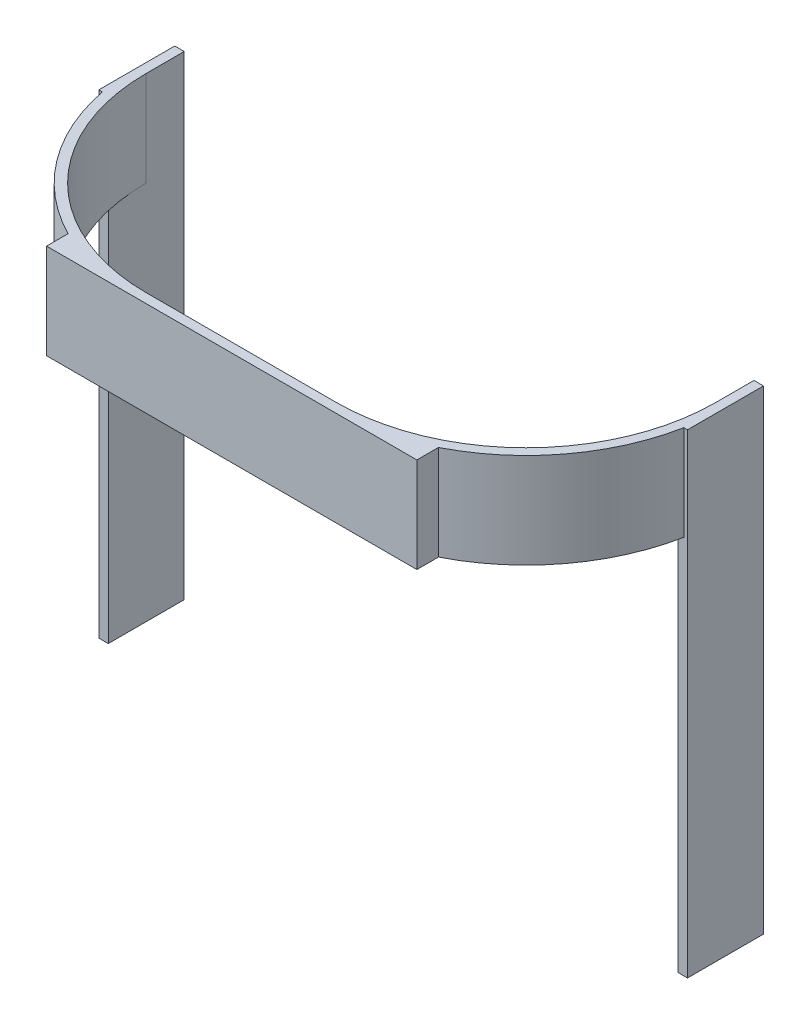
ISO-10303-21;
HEADER;
FILE_DESCRIPTION(('STEP AP214'),'2;1');
FILE_NAME('part.step','',(''),(''),'','','');
FILE_SCHEMA(('AUTOMOTIVE_DESIGN { 1 0 10303 214 1 1 1 1 }'));
ENDSEC;
DATA;
#1=APPLICATION_CONTEXT('core data for automotive mechanical design processes');
#2=APPLICATION_PROTOCOL_DEFINITION('international standard','automotive_design',2000,#1);
#3=PRODUCT_CONTEXT('',#1,'mechanical');
#4=PRODUCT('Part','Part','',(#3));
#5=PRODUCT_RELATED_PRODUCT_CATEGORY('part','',(#4));
#6=PRODUCT_DEFINITION_FORMATION('','',#4);
#7=PRODUCT_DEFINITION_CONTEXT('part definition',#1,'design');
#8=PRODUCT_DEFINITION('design','',#6,#7);
#9=PRODUCT_DEFINITION_SHAPE('','',#8);
#10=(LENGTH_UNIT() NAMED_UNIT(*) SI_UNIT(.MILLI.,.METRE.));
#11=(NAMED_UNIT(*) PLANE_ANGLE_UNIT() SI_UNIT($,.RADIAN.));
#12=(NAMED_UNIT(*) SI_UNIT($,.STERADIAN.) SOLID_ANGLE_UNIT());
#13=UNCERTAINTY_MEASURE_WITH_UNIT(LENGTH_MEASURE(1.E-05),#10,'distance_accuracy_value','');
#14=(GEOMETRIC_REPRESENTATION_CONTEXT(3) GLOBAL_UNCERTAINTY_ASSIGNED_CONTEXT((#13)) GLOBAL_UNIT_ASSIGNED_CONTEXT((#10,
#11,#12)) REPRESENTATION_CONTEXT('',''));
#15=CARTESIAN_POINT('',(0.,0.,0.));
#16=DIRECTION('',(0.,0.,1.));
#17=DIRECTION('',(1.,0.,0.));
#18=AXIS2_PLACEMENT_3D('',#15,#16,#17);
#19=CARTESIAN_POINT('',(40.,0.,0.));
#20=DIRECTION('',(0.,1.,0.));
#21=DIRECTION('',(0.,0.,1.));
#22=AXIS2_PLACEMENT_3D('',#19,#20,#21);
#23=PLANE('',#22);
#24=DIRECTION('',(0.,0.,1.));
#25=VECTOR('',#24,1.);
#26=CARTESIAN_POINT('',(-78.,0.,84.));
#27=LINE('',#26,#25);
#28=CARTESIAN_POINT('',(-78.,0.,74.9132832013121));
#29=VERTEX_POINT('',#28);
#30=CARTESIAN_POINT('',(-78.,0.,84.));
#31=VERTEX_POINT('',#30);
#32=EDGE_CURVE('E333',#29,#31,#27,.T.);
#33=ORIENTED_EDGE('',*,*,#32,.F.);
#34=CARTESIAN_POINT('',(-40.,0.,0.));
#35=DIRECTION('',(0.,1.,0.));
#36=DIRECTION('',(0.,0.,1.));
#37=AXIS2_PLACEMENT_3D('',#34,#35,#36);
#38=CIRCLE('',#37,84.);
#39=CARTESIAN_POINT('',(-122.462112512353,0.,16.));
#40=VERTEX_POINT('',#39);
#41=EDGE_CURVE('E163',#40,#29,#38,.T.);
#42=ORIENTED_EDGE('',*,*,#41,.F.);
#43=DIRECTION('',(-1.,0.,0.));
#44=VECTOR('',#43,1.);
#45=CARTESIAN_POINT('',(-124.,0.,16.));
#46=LINE('',#45,#44);
#47=CARTESIAN_POINT('',(-120.,0.,16.));
#48=VERTEX_POINT('',#47);
#49=EDGE_CURVE('E267',#48,#40,#46,.T.);
#50=ORIENTED_EDGE('',*,*,#49,.F.);
#51=DIRECTION('',(0.,0.,1.));
#52=VECTOR('',#51,1.);
#53=CARTESIAN_POINT('',(-120.,0.,-16.));
#54=LINE('',#53,#52);
#55=CARTESIAN_POINT('',(-120.,0.,0.));
#56=VERTEX_POINT('',#55);
#57=EDGE_CURVE('E11',#56,#48,#54,.T.);
#58=ORIENTED_EDGE('',*,*,#57,.F.);
#59=CARTESIAN_POINT('',(-40.,0.,0.));
#60=DIRECTION('',(0.,-1.,0.));
#61=DIRECTION('',(0.,0.,1.));
#62=AXIS2_PLACEMENT_3D('',#59,#60,#61);
#63=CIRCLE('',#62,80.);
#64=CARTESIAN_POINT('',(-40.,0.,80.));
#65=VERTEX_POINT('',#64);
#66=EDGE_CURVE('E160',#65,#56,#63,.T.);
#67=ORIENTED_EDGE('',*,*,#66,.F.);
#68=DIRECTION('',(-1.,0.,0.));
#69=VECTOR('',#68,1.);
#70=CARTESIAN_POINT('',(-40.,0.,80.));
#71=LINE('',#70,#69);
#72=CARTESIAN_POINT('',(40.,0.,80.));
#73=VERTEX_POINT('',#72);
#74=EDGE_CURVE('E157',#73,#65,#71,.T.);
#75=ORIENTED_EDGE('',*,*,#74,.F.);
#76=CARTESIAN_POINT('',(40.,0.,0.));
#77=DIRECTION('',(0.,-1.,0.));
#78=DIRECTION('',(0.,0.,1.));
#79=AXIS2_PLACEMENT_3D('',#76,#77,#78);
#80=CIRCLE('',#79,80.);
#81=CARTESIAN_POINT('',(120.,0.,0.));
#82=VERTEX_POINT('',#81);
#83=EDGE_CURVE('E154',#82,#73,#80,.T.);
#84=ORIENTED_EDGE('',*,*,#83,.F.);
#85=DIRECTION('',(0.,0.,-1.));
#86=VECTOR('',#85,1.);
#87=CARTESIAN_POINT('',(120.,0.,-16.));
#88=LINE('',#87,#86);
#89=CARTESIAN_POINT('',(120.,0.,16.));
#90=VERTEX_POINT('',#89);
#91=EDGE_CURVE('E85',#90,#82,#88,.T.);
#92=ORIENTED_EDGE('',*,*,#91,.F.);
#93=DIRECTION('',(-1.,0.,0.));
#94=VECTOR('',#93,1.);
#95=CARTESIAN_POINT('',(120.,0.,16.));
#96=LINE('',#95,#94);
#97=CARTESIAN_POINT('',(122.462112512353,0.,16.));
#98=VERTEX_POINT('',#97);
#99=EDGE_CURVE('E263',#98,#90,#96,.T.);
#100=ORIENTED_EDGE('',*,*,#99,.F.);
#101=CARTESIAN_POINT('',(40.,0.,0.));
#102=DIRECTION('',(0.,1.,0.));
#103=DIRECTION('',(0.,0.,1.));
#104=AXIS2_PLACEMENT_3D('',#101,#102,#103);
#105=CIRCLE('',#104,84.);
#106=CARTESIAN_POINT('',(78.,0.,74.9132832013121));
#107=VERTEX_POINT('',#106);
#108=EDGE_CURVE('E169',#107,#98,#105,.T.);
#109=ORIENTED_EDGE('',*,*,#108,.F.);
#110=DIRECTION('',(0.,0.,-1.));
#111=VECTOR('',#110,1.);
#112=CARTESIAN_POINT('',(78.,0.,84.));
#113=LINE('',#112,#111);
#114=CARTESIAN_POINT('',(78.,0.,84.));
#115=VERTEX_POINT('',#114);
#116=EDGE_CURVE('E331',#115,#107,#113,.T.);
#117=ORIENTED_EDGE('',*,*,#116,.F.);
#118=DIRECTION('',(1.,0.,0.));
#119=VECTOR('',#118,1.);
#120=CARTESIAN_POINT('',(-40.,0.,84.));
#121=LINE('',#120,#119);
#122=EDGE_CURVE('E166',#31,#115,#121,.T.);
#123=ORIENTED_EDGE('',*,*,#122,.F.);
#124=EDGE_LOOP('',(#33,#42,#50,#58,#67,#75,#84,#92,#100,#109,#117,#123));
#125=FACE_BOUND('',#124,.T.);
#126=ADVANCED_FACE('F37',(#125),#23,.F.);
#127=CARTESIAN_POINT('',(40.,40.,0.));
#128=DIRECTION('',(0.,-1.,0.));
#129=DIRECTION('',(0.,0.,-1.));
#130=AXIS2_PLACEMENT_3D('',#127,#128,#129);
#131=CYLINDRICAL_SURFACE('',#130,80.);
#132=ORIENTED_EDGE('',*,*,#83,.T.);
#133=DIRECTION('',(0.,-1.,0.));
#134=VECTOR('',#133,1.);
#135=CARTESIAN_POINT('',(40.,40.,80.));
#136=LINE('',#135,#134);
#137=CARTESIAN_POINT('',(40.,40.,80.));
#138=VERTEX_POINT('',#137);
#139=EDGE_CURVE('E41',#138,#73,#136,.T.);
#140=ORIENTED_EDGE('',*,*,#139,.F.);
#141=CARTESIAN_POINT('',(40.,40.,0.));
#142=DIRECTION('',(0.,-1.,0.));
#143=DIRECTION('',(0.,0.,1.));
#144=AXIS2_PLACEMENT_3D('',#141,#142,#143);
#145=CIRCLE('',#144,80.);
#146=CARTESIAN_POINT('',(120.,40.,0.));
#147=VERTEX_POINT('',#146);
#148=EDGE_CURVE('E172',#147,#138,#145,.T.);
#149=ORIENTED_EDGE('',*,*,#148,.F.);
#150=DIRECTION('',(0.,-1.,0.));
#151=VECTOR('',#150,1.);
#152=CARTESIAN_POINT('',(120.,40.,0.));
#153=LINE('',#152,#151);
#154=EDGE_CURVE('E150',#147,#82,#153,.T.);
#155=ORIENTED_EDGE('',*,*,#154,.T.);
#156=EDGE_LOOP('',(#132,#140,#149,#155));
#157=FACE_BOUND('',#156,.T.);
#158=ADVANCED_FACE('F39',(#157),#131,.F.);
#159=CARTESIAN_POINT('',(-40.,40.,80.));
#160=DIRECTION('',(0.,0.,1.));
#161=DIRECTION('',(1.,0.,0.));
#162=AXIS2_PLACEMENT_3D('',#159,#160,#161);
#163=PLANE('',#162);
#164=ORIENTED_EDGE('',*,*,#74,.T.);
#165=DIRECTION('',(0.,-1.,0.));
#166=VECTOR('',#165,1.);
#167=CARTESIAN_POINT('',(-40.,40.,80.));
#168=LINE('',#167,#166);
#169=CARTESIAN_POINT('',(-40.,40.,80.));
#170=VERTEX_POINT('',#169);
#171=EDGE_CURVE('E192',#170,#65,#168,.T.);
#172=ORIENTED_EDGE('',*,*,#171,.F.);
#173=DIRECTION('',(-1.,0.,0.));
#174=VECTOR('',#173,1.);
#175=CARTESIAN_POINT('',(-40.,40.,80.));
#176=LINE('',#175,#174);
#177=EDGE_CURVE('E94',#138,#170,#176,.T.);
#178=ORIENTED_EDGE('',*,*,#177,.F.);
#179=ORIENTED_EDGE('',*,*,#139,.T.);
#180=EDGE_LOOP('',(#164,#172,#178,#179));
#181=FACE_BOUND('',#180,.T.);
#182=ADVANCED_FACE('F198',(#181),#163,.F.);
#183=CARTESIAN_POINT('',(-40.,40.,0.));
#184=DIRECTION('',(0.,-1.,0.));
#185=DIRECTION('',(0.,0.,-1.));
#186=AXIS2_PLACEMENT_3D('',#183,#184,#185);
#187=CYLINDRICAL_SURFACE('',#186,80.);
#188=ORIENTED_EDGE('',*,*,#66,.T.);
#189=DIRECTION('',(0.,-1.,0.));
#190=VECTOR('',#189,1.);
#191=CARTESIAN_POINT('',(-120.,40.,0.));
#192=LINE('',#191,#190);
#193=CARTESIAN_POINT('',(-120.,40.,0.));
#194=VERTEX_POINT('',#193);
#195=EDGE_CURVE('E190',#194,#56,#192,.T.);
#196=ORIENTED_EDGE('',*,*,#195,.F.);
#197=CARTESIAN_POINT('',(-40.,40.,0.));
#198=DIRECTION('',(0.,-1.,0.));
#199=DIRECTION('',(0.,0.,1.));
#200=AXIS2_PLACEMENT_3D('',#197,#198,#199);
#201=CIRCLE('',#200,80.);
#202=EDGE_CURVE('E219',#170,#194,#201,.T.);
#203=ORIENTED_EDGE('',*,*,#202,.F.);
#204=ORIENTED_EDGE('',*,*,#171,.T.);
#205=EDGE_LOOP('',(#188,#196,#203,#204));
#206=FACE_BOUND('',#205,.T.);
#207=ADVANCED_FACE('F208',(#206),#187,.F.);
#208=CARTESIAN_POINT('',(-120.,40.,-16.));
#209=DIRECTION('',(-1.,0.,0.));
#210=DIRECTION('',(0.,0.,1.));
#211=AXIS2_PLACEMENT_3D('',#208,#209,#210);
#212=PLANE('',#211);
#213=ORIENTED_EDGE('',*,*,#195,.T.);
#214=ORIENTED_EDGE('',*,*,#57,.T.);
#215=DIRECTION('',(0.,1.,0.));
#216=VECTOR('',#215,1.);
#217=CARTESIAN_POINT('',(-120.,-160.,16.));
#218=LINE('',#217,#216);
#219=CARTESIAN_POINT('',(-120.,-160.,16.));
#220=VERTEX_POINT('',#219);
#221=EDGE_CURVE('E158',#220,#48,#218,.T.);
#222=ORIENTED_EDGE('',*,*,#221,.F.);
#223=DIRECTION('',(0.,0.,1.));
#224=VECTOR('',#223,1.);
#225=CARTESIAN_POINT('',(-120.,-160.,-16.));
#226=LINE('',#225,#224);
#227=CARTESIAN_POINT('',(-120.,-160.,-16.));
#228=VERTEX_POINT('',#227);
#229=EDGE_CURVE('E274',#228,#220,#226,.T.);
#230=ORIENTED_EDGE('',*,*,#229,.F.);
#231=DIRECTION('',(0.,-1.,0.));
#232=VECTOR('',#231,1.);
#233=CARTESIAN_POINT('',(-120.,40.,-16.));
#234=LINE('',#233,#232);
#235=CARTESIAN_POINT('',(-120.,40.,-16.));
#236=VERTEX_POINT('',#235);
#237=EDGE_CURVE('E187',#236,#228,#234,.T.);
#238=ORIENTED_EDGE('',*,*,#237,.F.);
#239=DIRECTION('',(0.,0.,-1.));
#240=VECTOR('',#239,1.);
#241=CARTESIAN_POINT('',(-120.,40.,-16.));
#242=LINE('',#241,#240);
#243=EDGE_CURVE('E215',#194,#236,#242,.T.);
#244=ORIENTED_EDGE('',*,*,#243,.F.);
#245=EDGE_LOOP('',(#213,#214,#222,#230,#238,#244));
#246=FACE_BOUND('',#245,.T.);
#247=ADVANCED_FACE('F211',(#246),#212,.F.);
#248=CARTESIAN_POINT('',(-124.,40.,-16.));
#249=DIRECTION('',(0.,0.,1.));
#250=DIRECTION('',(1.,0.,0.));
#251=AXIS2_PLACEMENT_3D('',#248,#249,#250);
#252=PLANE('',#251);
#253=ORIENTED_EDGE('',*,*,#237,.T.);
#254=DIRECTION('',(1.,0.,0.));
#255=VECTOR('',#254,1.);
#256=CARTESIAN_POINT('',(-124.,-160.,-16.));
#257=LINE('',#256,#255);
#258=CARTESIAN_POINT('',(-124.,-160.,-16.));
#259=VERTEX_POINT('',#258);
#260=EDGE_CURVE('E271',#259,#228,#257,.T.);
#261=ORIENTED_EDGE('',*,*,#260,.F.);
#262=DIRECTION('',(0.,-1.,0.));
#263=VECTOR('',#262,1.);
#264=CARTESIAN_POINT('',(-124.,40.,-16.));
#265=LINE('',#264,#263);
#266=CARTESIAN_POINT('',(-124.,40.,-16.));
#267=VERTEX_POINT('',#266);
#268=EDGE_CURVE('E184',#267,#259,#265,.T.);
#269=ORIENTED_EDGE('',*,*,#268,.F.);
#270=DIRECTION('',(-1.,0.,0.));
#271=VECTOR('',#270,1.);
#272=CARTESIAN_POINT('',(-124.,40.,-16.));
#273=LINE('',#272,#271);
#274=EDGE_CURVE('E218',#236,#267,#273,.T.);
#275=ORIENTED_EDGE('',*,*,#274,.F.);
#276=EDGE_LOOP('',(#253,#261,#269,#275));
#277=FACE_BOUND('',#276,.T.);
#278=ADVANCED_FACE('F386',(#277),#252,.F.);
#279=CARTESIAN_POINT('',(-124.,40.,-16.));
#280=DIRECTION('',(1.,0.,0.));
#281=DIRECTION('',(0.,0.,-1.));
#282=AXIS2_PLACEMENT_3D('',#279,#280,#281);
#283=PLANE('',#282);
#284=ORIENTED_EDGE('',*,*,#268,.T.);
#285=DIRECTION('',(0.,0.,-1.));
#286=VECTOR('',#285,1.);
#287=CARTESIAN_POINT('',(-124.,-160.,-16.));
#288=LINE('',#287,#286);
#289=CARTESIAN_POINT('',(-124.,-160.,16.));
#290=VERTEX_POINT('',#289);
#291=EDGE_CURVE('E268',#290,#259,#288,.T.);
#292=ORIENTED_EDGE('',*,*,#291,.F.);
#293=DIRECTION('',(0.,-1.,0.));
#294=VECTOR('',#293,1.);
#295=CARTESIAN_POINT('',(-124.,40.,16.));
#296=LINE('',#295,#294);
#297=CARTESIAN_POINT('',(-124.,40.,16.));
#298=VERTEX_POINT('',#297);
#299=EDGE_CURVE('E181',#298,#290,#296,.T.);
#300=ORIENTED_EDGE('',*,*,#299,.F.);
#301=DIRECTION('',(0.,0.,1.));
#302=VECTOR('',#301,1.);
#303=CARTESIAN_POINT('',(-124.,40.,-16.));
#304=LINE('',#303,#302);
#305=EDGE_CURVE('E221',#267,#298,#304,.T.);
#306=ORIENTED_EDGE('',*,*,#305,.F.);
#307=EDGE_LOOP('',(#284,#292,#300,#306));
#308=FACE_BOUND('',#307,.T.);
#309=ADVANCED_FACE('F382',(#308),#283,.F.);
#310=CARTESIAN_POINT('',(-124.,40.,16.));
#311=DIRECTION('',(0.,0.,-1.));
#312=DIRECTION('',(-1.,0.,0.));
#313=AXIS2_PLACEMENT_3D('',#310,#311,#312);
#314=PLANE('',#313);
#315=ORIENTED_EDGE('',*,*,#299,.T.);
#316=DIRECTION('',(-1.,0.,0.));
#317=VECTOR('',#316,1.);
#318=CARTESIAN_POINT('',(-124.,-160.,16.));
#319=LINE('',#318,#317);
#320=EDGE_CURVE('E277',#220,#290,#319,.T.);
#321=ORIENTED_EDGE('',*,*,#320,.F.);
#322=ORIENTED_EDGE('',*,*,#221,.T.);
#323=ORIENTED_EDGE('',*,*,#49,.T.);
#324=DIRECTION('',(0.,-1.,0.));
#325=VECTOR('',#324,1.);
#326=CARTESIAN_POINT('',(-122.462112512353,40.,16.));
#327=LINE('',#326,#325);
#328=CARTESIAN_POINT('',(-122.462112512353,40.,16.));
#329=VERTEX_POINT('',#328);
#330=EDGE_CURVE('E179',#329,#40,#327,.T.);
#331=ORIENTED_EDGE('',*,*,#330,.F.);
#332=DIRECTION('',(1.,0.,0.));
#333=VECTOR('',#332,1.);
#334=CARTESIAN_POINT('',(-124.,40.,16.));
#335=LINE('',#334,#333);
#336=EDGE_CURVE('E227',#298,#329,#335,.T.);
#337=ORIENTED_EDGE('',*,*,#336,.F.);
#338=EDGE_LOOP('',(#315,#321,#322,#323,#331,#337));
#339=FACE_BOUND('',#338,.T.);
#340=ADVANCED_FACE('F285',(#339),#314,.F.);
#341=CARTESIAN_POINT('',(-40.,40.,0.));
#342=DIRECTION('',(0.,-1.,0.));
#343=DIRECTION('',(0.,0.,-1.));
#344=AXIS2_PLACEMENT_3D('',#341,#342,#343);
#345=CYLINDRICAL_SURFACE('',#344,84.);
#346=ORIENTED_EDGE('',*,*,#41,.T.);
#347=DIRECTION('',(0.,1.,0.));
#348=VECTOR('',#347,1.);
#349=CARTESIAN_POINT('',(-78.,0.,74.9132832013121));
#350=LINE('',#349,#348);
#351=CARTESIAN_POINT('',(-78.,40.,74.9132832013121));
#352=VERTEX_POINT('',#351);
#353=EDGE_CURVE('E332',#29,#352,#350,.T.);
#354=ORIENTED_EDGE('',*,*,#353,.T.);
#355=CARTESIAN_POINT('',(-40.,40.,0.));
#356=DIRECTION('',(0.,1.,0.));
#357=DIRECTION('',(0.,0.,1.));
#358=AXIS2_PLACEMENT_3D('',#355,#356,#357);
#359=CIRCLE('',#358,84.);
#360=EDGE_CURVE('E229',#329,#352,#359,.T.);
#361=ORIENTED_EDGE('',*,*,#360,.F.);
#362=ORIENTED_EDGE('',*,*,#330,.T.);
#363=EDGE_LOOP('',(#346,#354,#361,#362));
#364=FACE_BOUND('',#363,.T.);
#365=ADVANCED_FACE('F375',(#364),#345,.T.);
#366=CARTESIAN_POINT('',(-40.,40.,84.));
#367=DIRECTION('',(0.,0.,-1.));
#368=DIRECTION('',(-1.,0.,0.));
#369=AXIS2_PLACEMENT_3D('',#366,#367,#368);
#370=PLANE('',#369);
#371=ORIENTED_EDGE('',*,*,#122,.T.);
#372=DIRECTION('',(0.,1.,0.));
#373=VECTOR('',#372,1.);
#374=CARTESIAN_POINT('',(78.,0.,84.));
#375=LINE('',#374,#373);
#376=CARTESIAN_POINT('',(78.,40.,84.));
#377=VERTEX_POINT('',#376);
#378=EDGE_CURVE('E324',#115,#377,#375,.T.);
#379=ORIENTED_EDGE('',*,*,#378,.T.);
#380=DIRECTION('',(1.,0.,0.));
#381=VECTOR('',#380,1.);
#382=CARTESIAN_POINT('',(-40.,40.,84.));
#383=LINE('',#382,#381);
#384=CARTESIAN_POINT('',(-78.,40.,84.));
#385=VERTEX_POINT('',#384);
#386=EDGE_CURVE('E231',#385,#377,#383,.T.);
#387=ORIENTED_EDGE('',*,*,#386,.F.);
#388=DIRECTION('',(0.,1.,0.));
#389=VECTOR('',#388,1.);
#390=CARTESIAN_POINT('',(-78.,0.,84.));
#391=LINE('',#390,#389);
#392=EDGE_CURVE('E326',#31,#385,#391,.T.);
#393=ORIENTED_EDGE('',*,*,#392,.F.);
#394=EDGE_LOOP('',(#371,#379,#387,#393));
#395=FACE_BOUND('',#394,.T.);
#396=ADVANCED_FACE('F323',(#395),#370,.F.);
#397=CARTESIAN_POINT('',(40.,40.,0.));
#398=DIRECTION('',(0.,-1.,0.));
#399=DIRECTION('',(0.,0.,-1.));
#400=AXIS2_PLACEMENT_3D('',#397,#398,#399);
#401=CYLINDRICAL_SURFACE('',#400,84.);
#402=CARTESIAN_POINT('',(40.,40.,0.));
#403=DIRECTION('',(0.,1.,0.));
#404=DIRECTION('',(0.,0.,1.));
#405=AXIS2_PLACEMENT_3D('',#402,#403,#404);
#406=CIRCLE('',#405,84.);
#407=CARTESIAN_POINT('',(78.,40.,74.9132832013121));
#408=VERTEX_POINT('',#407);
#409=CARTESIAN_POINT('',(122.462112512353,40.,16.));
#410=VERTEX_POINT('',#409);
#411=EDGE_CURVE('E233',#408,#410,#406,.T.);
#412=ORIENTED_EDGE('',*,*,#411,.F.);
#413=DIRECTION('',(0.,-1.,0.));
#414=VECTOR('',#413,1.);
#415=CARTESIAN_POINT('',(78.,40.,74.9132832013121));
#416=LINE('',#415,#414);
#417=EDGE_CURVE('E264',#408,#107,#416,.T.);
#418=ORIENTED_EDGE('',*,*,#417,.T.);
#419=ORIENTED_EDGE('',*,*,#108,.T.);
#420=DIRECTION('',(0.,-1.,0.));
#421=VECTOR('',#420,1.);
#422=CARTESIAN_POINT('',(122.462112512353,40.,16.));
#423=LINE('',#422,#421);
#424=EDGE_CURVE('E176',#410,#98,#423,.T.);
#425=ORIENTED_EDGE('',*,*,#424,.F.);
#426=EDGE_LOOP('',(#412,#418,#419,#425));
#427=FACE_BOUND('',#426,.T.);
#428=ADVANCED_FACE('F238',(#427),#401,.T.);
#429=CARTESIAN_POINT('',(122.462112512353,40.,16.));
#430=DIRECTION('',(0.,0.,-1.));
#431=DIRECTION('',(-1.,0.,0.));
#432=AXIS2_PLACEMENT_3D('',#429,#430,#431);
#433=PLANE('',#432);
#434=ORIENTED_EDGE('',*,*,#424,.T.);
#435=ORIENTED_EDGE('',*,*,#99,.T.);
#436=DIRECTION('',(0.,1.,0.));
#437=VECTOR('',#436,1.);
#438=CARTESIAN_POINT('',(120.,-160.,16.));
#439=LINE('',#438,#437);
#440=CARTESIAN_POINT('',(120.,-160.,16.));
#441=VERTEX_POINT('',#440);
#442=EDGE_CURVE('E256',#441,#90,#439,.T.);
#443=ORIENTED_EDGE('',*,*,#442,.F.);
#444=DIRECTION('',(-1.,0.,0.));
#445=VECTOR('',#444,1.);
#446=CARTESIAN_POINT('',(120.,-160.,16.));
#447=LINE('',#446,#445);
#448=CARTESIAN_POINT('',(124.,-160.,16.));
#449=VERTEX_POINT('',#448);
#450=EDGE_CURVE('E248',#449,#441,#447,.T.);
#451=ORIENTED_EDGE('',*,*,#450,.F.);
#452=DIRECTION('',(0.,-1.,0.));
#453=VECTOR('',#452,1.);
#454=CARTESIAN_POINT('',(124.,40.,16.));
#455=LINE('',#454,#453);
#456=CARTESIAN_POINT('',(124.,40.,16.));
#457=VERTEX_POINT('',#456);
#458=EDGE_CURVE('E144',#457,#449,#455,.T.);
#459=ORIENTED_EDGE('',*,*,#458,.F.);
#460=DIRECTION('',(1.,0.,0.));
#461=VECTOR('',#460,1.);
#462=CARTESIAN_POINT('',(122.462112512353,40.,16.));
#463=LINE('',#462,#461);
#464=EDGE_CURVE('E129',#410,#457,#463,.T.);
#465=ORIENTED_EDGE('',*,*,#464,.F.);
#466=EDGE_LOOP('',(#434,#435,#443,#451,#459,#465));
#467=FACE_BOUND('',#466,.T.);
#468=ADVANCED_FACE('F243',(#467),#433,.F.);
#469=CARTESIAN_POINT('',(124.,40.,-16.));
#470=DIRECTION('',(-1.,0.,0.));
#471=DIRECTION('',(0.,0.,1.));
#472=AXIS2_PLACEMENT_3D('',#469,#470,#471);
#473=PLANE('',#472);
#474=ORIENTED_EDGE('',*,*,#458,.T.);
#475=DIRECTION('',(0.,0.,1.));
#476=VECTOR('',#475,1.);
#477=CARTESIAN_POINT('',(124.,-160.,-16.));
#478=LINE('',#477,#476);
#479=CARTESIAN_POINT('',(124.,-160.,-16.));
#480=VERTEX_POINT('',#479);
#481=EDGE_CURVE('E140',#480,#449,#478,.T.);
#482=ORIENTED_EDGE('',*,*,#481,.F.);
#483=DIRECTION('',(0.,-1.,0.));
#484=VECTOR('',#483,1.);
#485=CARTESIAN_POINT('',(124.,40.,-16.));
#486=LINE('',#485,#484);
#487=CARTESIAN_POINT('',(124.,40.,-16.));
#488=VERTEX_POINT('',#487);
#489=EDGE_CURVE('E136',#488,#480,#486,.T.);
#490=ORIENTED_EDGE('',*,*,#489,.F.);
#491=DIRECTION('',(0.,0.,-1.));
#492=VECTOR('',#491,1.);
#493=CARTESIAN_POINT('',(124.,40.,-16.));
#494=LINE('',#493,#492);
#495=EDGE_CURVE('E121',#457,#488,#494,.T.);
#496=ORIENTED_EDGE('',*,*,#495,.F.);
#497=EDGE_LOOP('',(#474,#482,#490,#496));
#498=FACE_BOUND('',#497,.T.);
#499=ADVANCED_FACE('F137',(#498),#473,.F.);
#500=CARTESIAN_POINT('',(120.,40.,-16.));
#501=DIRECTION('',(0.,0.,1.));
#502=DIRECTION('',(1.,0.,0.));
#503=AXIS2_PLACEMENT_3D('',#500,#501,#502);
#504=PLANE('',#503);
#505=ORIENTED_EDGE('',*,*,#489,.T.);
#506=DIRECTION('',(1.,0.,0.));
#507=VECTOR('',#506,1.);
#508=CARTESIAN_POINT('',(120.,-160.,-16.));
#509=LINE('',#508,#507);
#510=CARTESIAN_POINT('',(120.,-160.,-16.));
#511=VERTEX_POINT('',#510);
#512=EDGE_CURVE('E254',#511,#480,#509,.T.);
#513=ORIENTED_EDGE('',*,*,#512,.F.);
#514=DIRECTION('',(0.,-1.,0.));
#515=VECTOR('',#514,1.);
#516=CARTESIAN_POINT('',(120.,40.,-16.));
#517=LINE('',#516,#515);
#518=CARTESIAN_POINT('',(120.,40.,-16.));
#519=VERTEX_POINT('',#518);
#520=EDGE_CURVE('E145',#519,#511,#517,.T.);
#521=ORIENTED_EDGE('',*,*,#520,.F.);
#522=DIRECTION('',(-1.,0.,0.));
#523=VECTOR('',#522,1.);
#524=CARTESIAN_POINT('',(120.,40.,-16.));
#525=LINE('',#524,#523);
#526=EDGE_CURVE('E126',#488,#519,#525,.T.);
#527=ORIENTED_EDGE('',*,*,#526,.F.);
#528=EDGE_LOOP('',(#505,#513,#521,#527));
#529=FACE_BOUND('',#528,.T.);
#530=ADVANCED_FACE('F147',(#529),#504,.F.);
#531=CARTESIAN_POINT('',(120.,40.,-16.));
#532=DIRECTION('',(1.,0.,0.));
#533=DIRECTION('',(0.,0.,-1.));
#534=AXIS2_PLACEMENT_3D('',#531,#532,#533);
#535=PLANE('',#534);
#536=ORIENTED_EDGE('',*,*,#520,.T.);
#537=DIRECTION('',(0.,0.,-1.));
#538=VECTOR('',#537,1.);
#539=CARTESIAN_POINT('',(120.,-160.,-16.));
#540=LINE('',#539,#538);
#541=EDGE_CURVE('E258',#441,#511,#540,.T.);
#542=ORIENTED_EDGE('',*,*,#541,.F.);
#543=ORIENTED_EDGE('',*,*,#442,.T.);
#544=ORIENTED_EDGE('',*,*,#91,.T.);
#545=ORIENTED_EDGE('',*,*,#154,.F.);
#546=DIRECTION('',(0.,0.,1.));
#547=VECTOR('',#546,1.);
#548=CARTESIAN_POINT('',(120.,40.,-16.));
#549=LINE('',#548,#547);
#550=EDGE_CURVE('E61',#519,#147,#549,.T.);
#551=ORIENTED_EDGE('',*,*,#550,.F.);
#552=EDGE_LOOP('',(#536,#542,#543,#544,#545,#551));
#553=FACE_BOUND('',#552,.T.);
#554=ADVANCED_FACE('F346',(#553),#535,.F.);
#555=CARTESIAN_POINT('',(40.,40.,0.));
#556=DIRECTION('',(0.,1.,0.));
#557=DIRECTION('',(0.,0.,1.));
#558=AXIS2_PLACEMENT_3D('',#555,#556,#557);
#559=PLANE('',#558);
#560=ORIENTED_EDGE('',*,*,#360,.T.);
#561=DIRECTION('',(0.,0.,1.));
#562=VECTOR('',#561,1.);
#563=CARTESIAN_POINT('',(-78.,40.,84.));
#564=LINE('',#563,#562);
#565=EDGE_CURVE('E335',#352,#385,#564,.T.);
#566=ORIENTED_EDGE('',*,*,#565,.T.);
#567=ORIENTED_EDGE('',*,*,#386,.T.);
#568=DIRECTION('',(0.,0.,-1.));
#569=VECTOR('',#568,1.);
#570=CARTESIAN_POINT('',(78.,40.,84.));
#571=LINE('',#570,#569);
#572=EDGE_CURVE('E53',#377,#408,#571,.T.);
#573=ORIENTED_EDGE('',*,*,#572,.T.);
#574=ORIENTED_EDGE('',*,*,#411,.T.);
#575=ORIENTED_EDGE('',*,*,#464,.T.);
#576=ORIENTED_EDGE('',*,*,#495,.T.);
#577=ORIENTED_EDGE('',*,*,#526,.T.);
#578=ORIENTED_EDGE('',*,*,#550,.T.);
#579=ORIENTED_EDGE('',*,*,#148,.T.);
#580=ORIENTED_EDGE('',*,*,#177,.T.);
#581=ORIENTED_EDGE('',*,*,#202,.T.);
#582=ORIENTED_EDGE('',*,*,#243,.T.);
#583=ORIENTED_EDGE('',*,*,#274,.T.);
#584=ORIENTED_EDGE('',*,*,#305,.T.);
#585=ORIENTED_EDGE('',*,*,#336,.T.);
#586=EDGE_LOOP('',(#560,#566,#567,#573,#574,#575,#576,#577,#578,#579,#580,#581,#582,#583,#584,#585));
#587=FACE_BOUND('',#586,.T.);
#588=ADVANCED_FACE('F124',(#587),#559,.T.);
#589=CARTESIAN_POINT('',(0.,-160.,0.));
#590=DIRECTION('',(0.,1.,0.));
#591=DIRECTION('',(0.,0.,1.));
#592=AXIS2_PLACEMENT_3D('',#589,#590,#591);
#593=PLANE('',#592);
#594=ORIENTED_EDGE('',*,*,#291,.T.);
#595=ORIENTED_EDGE('',*,*,#260,.T.);
#596=ORIENTED_EDGE('',*,*,#229,.T.);
#597=ORIENTED_EDGE('',*,*,#320,.T.);
#598=EDGE_LOOP('',(#594,#595,#596,#597));
#599=FACE_BOUND('',#598,.T.);
#600=ADVANCED_FACE('F353',(#599),#593,.F.);
#601=CARTESIAN_POINT('',(0.,-160.,0.));
#602=DIRECTION('',(0.,1.,0.));
#603=DIRECTION('',(0.,0.,1.));
#604=AXIS2_PLACEMENT_3D('',#601,#602,#603);
#605=PLANE('',#604);
#606=ORIENTED_EDGE('',*,*,#541,.T.);
#607=ORIENTED_EDGE('',*,*,#512,.T.);
#608=ORIENTED_EDGE('',*,*,#481,.T.);
#609=ORIENTED_EDGE('',*,*,#450,.T.);
#610=EDGE_LOOP('',(#606,#607,#608,#609));
#611=FACE_BOUND('',#610,.T.);
#612=ADVANCED_FACE('F253',(#611),#605,.F.);
#613=CARTESIAN_POINT('',(78.,0.,84.));
#614=DIRECTION('',(1.,0.,0.));
#615=DIRECTION('',(0.,0.,-1.));
#616=AXIS2_PLACEMENT_3D('',#613,#614,#615);
#617=PLANE('',#616);
#618=ORIENTED_EDGE('',*,*,#417,.F.);
#619=ORIENTED_EDGE('',*,*,#572,.F.);
#620=ORIENTED_EDGE('',*,*,#378,.F.);
#621=ORIENTED_EDGE('',*,*,#116,.T.);
#622=EDGE_LOOP('',(#618,#619,#620,#621));
#623=FACE_BOUND('',#622,.T.);
#624=ADVANCED_FACE('F330',(#623),#617,.T.);
#625=CARTESIAN_POINT('',(-78.,0.,84.));
#626=DIRECTION('',(-1.,0.,0.));
#627=DIRECTION('',(0.,0.,1.));
#628=AXIS2_PLACEMENT_3D('',#625,#626,#627);
#629=PLANE('',#628);
#630=ORIENTED_EDGE('',*,*,#565,.F.);
#631=ORIENTED_EDGE('',*,*,#353,.F.);
#632=ORIENTED_EDGE('',*,*,#32,.T.);
#633=ORIENTED_EDGE('',*,*,#392,.T.);
#634=EDGE_LOOP('',(#630,#631,#632,#633));
#635=FACE_BOUND('',#634,.T.);
#636=ADVANCED_FACE('F368',(#635),#629,.T.);
#637=CLOSED_SHELL('',(#126,#158,#182,#207,#247,#278,#309,#340,#365,#396,#428,#468,#499,#530,
#554,#588,#600,#612,#624,#636));
#638=MANIFOLD_SOLID_BREP('B2',#637);
#639=ADVANCED_BREP_SHAPE_REPRESENTATION('',(#18,#638),#14);
#640=SHAPE_DEFINITION_REPRESENTATION(#9,#639);
ENDSEC;
END-ISO-10303-21;
